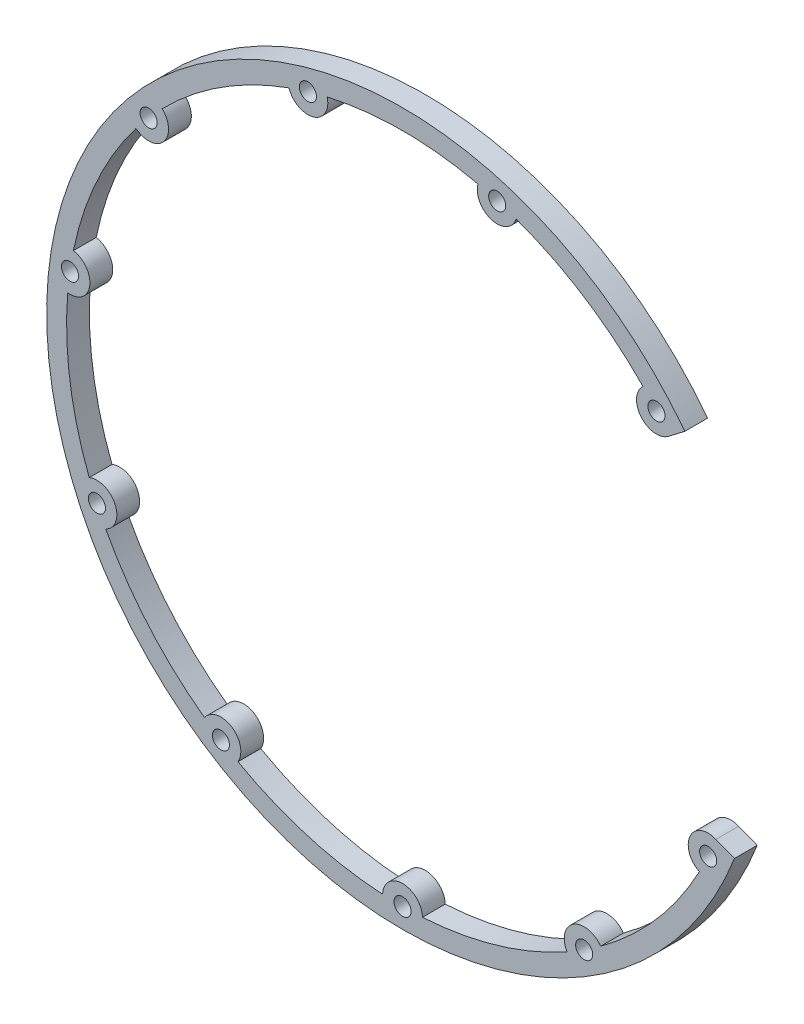
ISO-10303-21;
HEADER;
FILE_DESCRIPTION(('STEP AP214'),'2;1');
FILE_NAME('part.step','',(''),(''),'','','');
FILE_SCHEMA(('AUTOMOTIVE_DESIGN { 1 0 10303 214 1 1 1 1 }'));
ENDSEC;
DATA;
#1=APPLICATION_CONTEXT('core data for automotive mechanical design processes');
#2=APPLICATION_PROTOCOL_DEFINITION('international standard','automotive_design',2000,#1);
#3=PRODUCT_CONTEXT('',#1,'mechanical');
#4=PRODUCT('Part','Part','',(#3));
#5=PRODUCT_RELATED_PRODUCT_CATEGORY('part','',(#4));
#6=PRODUCT_DEFINITION_FORMATION('','',#4);
#7=PRODUCT_DEFINITION_CONTEXT('part definition',#1,'design');
#8=PRODUCT_DEFINITION('design','',#6,#7);
#9=PRODUCT_DEFINITION_SHAPE('','',#8);
#10=(LENGTH_UNIT() NAMED_UNIT(*) SI_UNIT(.MILLI.,.METRE.));
#11=(NAMED_UNIT(*) PLANE_ANGLE_UNIT() SI_UNIT($,.RADIAN.));
#12=(NAMED_UNIT(*) SI_UNIT($,.STERADIAN.) SOLID_ANGLE_UNIT());
#13=UNCERTAINTY_MEASURE_WITH_UNIT(LENGTH_MEASURE(1.E-05),#10,'distance_accuracy_value','');
#14=(GEOMETRIC_REPRESENTATION_CONTEXT(3) GLOBAL_UNCERTAINTY_ASSIGNED_CONTEXT((#13)) GLOBAL_UNIT_ASSIGNED_CONTEXT((#10,
#11,#12)) REPRESENTATION_CONTEXT('',''));
#15=CARTESIAN_POINT('',(0.,0.,0.));
#16=DIRECTION('',(0.,0.,1.));
#17=DIRECTION('',(1.,0.,0.));
#18=AXIS2_PLACEMENT_3D('',#15,#16,#17);
#19=CARTESIAN_POINT('',(0.,0.,4.));
#20=DIRECTION('',(0.,0.,-1.));
#21=DIRECTION('',(-1.,0.,0.));
#22=AXIS2_PLACEMENT_3D('',#19,#20,#21);
#23=PLANE('',#22);
#24=CARTESIAN_POINT('',(0.,0.,4.));
#25=DIRECTION('',(0.,0.,-1.));
#26=DIRECTION('',(-1.,0.,0.));
#27=AXIS2_PLACEMENT_3D('',#24,#25,#26);
#28=CIRCLE('',#27,59.);
#29=CARTESIAN_POINT('',(28.8985905029534,-51.4380352165847,4.));
#30=VERTEX_POINT('',#29);
#31=CARTESIAN_POINT('',(3.49846005335218,-58.896186440678,4.));
#32=VERTEX_POINT('',#31);
#33=EDGE_CURVE('E290',#30,#32,#28,.T.);
#34=ORIENTED_EDGE('',*,*,#33,.T.);
#35=CARTESIAN_POINT('',(0.,-59.,4.));
#36=DIRECTION('',(0.,0.,1.));
#37=DIRECTION('',(1.,0.,0.));
#38=AXIS2_PLACEMENT_3D('',#35,#36,#37);
#39=CIRCLE('',#38,3.5);
#40=CARTESIAN_POINT('',(-3.49846005335218,-58.896186440678,4.));
#41=VERTEX_POINT('',#40);
#42=EDGE_CURVE('E142',#32,#41,#39,.T.);
#43=ORIENTED_EDGE('',*,*,#42,.T.);
#44=CARTESIAN_POINT('',(0.,0.,4.));
#45=DIRECTION('',(0.,0.,-1.));
#46=DIRECTION('',(-1.,0.,0.));
#47=AXIS2_PLACEMENT_3D('',#44,#45,#46);
#48=CIRCLE('',#47,59.);
#49=CARTESIAN_POINT('',(-28.8985905029542,-51.4380352165843,4.));
#50=VERTEX_POINT('',#49);
#51=EDGE_CURVE('E367',#41,#50,#48,.T.);
#52=ORIENTED_EDGE('',*,*,#51,.T.);
#53=CARTESIAN_POINT('',(-31.8978082298803,-49.6339584370397,4.));
#54=DIRECTION('',(0.,0.,1.));
#55=DIRECTION('',(1.,0.,0.));
#56=AXIS2_PLACEMENT_3D('',#53,#54,#55);
#57=CIRCLE('',#56,3.5);
#58=CARTESIAN_POINT('',(-34.7847742616568,-47.6552146104242,4.));
#59=VERTEX_POINT('',#58);
#60=EDGE_CURVE('E387',#50,#59,#57,.T.);
#61=ORIENTED_EDGE('',*,*,#60,.T.);
#62=CARTESIAN_POINT('',(0.,0.,4.));
#63=DIRECTION('',(0.,0.,-1.));
#64=DIRECTION('',(-1.,0.,0.));
#65=AXIS2_PLACEMENT_3D('',#62,#63,#64);
#66=CIRCLE('',#65,59.);
#67=CARTESIAN_POINT('',(-52.1205427622558,-27.6486712550145,4.));
#68=VERTEX_POINT('',#67);
#69=EDGE_CURVE('E383',#59,#68,#66,.T.);
#70=ORIENTED_EDGE('',*,*,#69,.T.);
#71=CARTESIAN_POINT('',(-53.6682877259166,-24.5094857671112,4.));
#72=DIRECTION('',(0.,0.,1.));
#73=DIRECTION('',(1.,0.,0.));
#74=AXIS2_PLACEMENT_3D('',#71,#72,#73);
#75=CIRCLE('',#74,3.5);
#76=CARTESIAN_POINT('',(-55.0271684193556,-21.2840488570168,4.));
#77=VERTEX_POINT('',#76);
#78=EDGE_CURVE('E386',#68,#77,#75,.T.);
#79=ORIENTED_EDGE('',*,*,#78,.T.);
#80=CARTESIAN_POINT('',(0.,0.,4.));
#81=DIRECTION('',(0.,0.,-1.));
#82=DIRECTION('',(-1.,0.,0.));
#83=AXIS2_PLACEMENT_3D('',#80,#81,#82);
#84=CIRCLE('',#83,59.);
#85=CARTESIAN_POINT('',(-58.7945909606985,4.91895047384666,4.));
#86=VERTEX_POINT('',#85);
#87=EDGE_CURVE('E391',#77,#86,#84,.T.);
#88=ORIENTED_EDGE('',*,*,#87,.T.);
#89=CARTESIAN_POINT('',(-58.399465070975,8.39657545812405,4.));
#90=DIRECTION('',(0.,0.,1.));
#91=DIRECTION('',(1.,0.,0.));
#92=AXIS2_PLACEMENT_3D('',#89,#90,#91);
#93=CIRCLE('',#92,3.5);
#94=CARTESIAN_POINT('',(-57.7988254073017,11.8446520225905,4.));
#95=VERTEX_POINT('',#94);
#96=EDGE_CURVE('E398',#86,#95,#93,.T.);
#97=ORIENTED_EDGE('',*,*,#96,.T.);
#98=CARTESIAN_POINT('',(0.,0.,4.));
#99=DIRECTION('',(0.,0.,-1.));
#100=DIRECTION('',(-1.,0.,0.));
#101=AXIS2_PLACEMENT_3D('',#98,#99,#100);
#102=CIRCLE('',#101,59.);
#103=CARTESIAN_POINT('',(-46.8017719518477,35.9248401829047,4.));
#104=VERTEX_POINT('',#103);
#105=EDGE_CURVE('E401',#95,#104,#102,.T.);
#106=ORIENTED_EDGE('',*,*,#105,.T.);
#107=CARTESIAN_POINT('',(-44.589224886901,38.6367833027721,4.));
#108=DIRECTION('',(0.,0.,1.));
#109=DIRECTION('',(1.,0.,0.));
#110=AXIS2_PLACEMENT_3D('',#107,#108,#109);
#111=CIRCLE('',#110,3.50000000000001);
#112=CARTESIAN_POINT('',(-42.2197637154147,41.2127595753372,4.));
#113=VERTEX_POINT('',#112);
#114=EDGE_CURVE('E404',#104,#113,#111,.T.);
#115=ORIENTED_EDGE('',*,*,#114,.T.);
#116=CARTESIAN_POINT('',(0.,0.,4.));
#117=DIRECTION('',(0.,0.,-1.));
#118=DIRECTION('',(-1.,0.,0.));
#119=AXIS2_PLACEMENT_3D('',#116,#117,#118);
#120=CIRCLE('',#119,59.);
#121=CARTESIAN_POINT('',(-19.9497210338038,55.5248469666816,4.));
#122=VERTEX_POINT('',#121);
#123=EDGE_CURVE('E407',#113,#122,#120,.T.);
#124=ORIENTED_EDGE('',*,*,#123,.T.);
#125=CARTESIAN_POINT('',(-16.622220853644,56.6100854432555,4.));
#126=DIRECTION('',(0.,0.,1.));
#127=DIRECTION('',(1.,0.,0.));
#128=AXIS2_PLACEMENT_3D('',#125,#126,#127);
#129=CIRCLE('',#128,3.5);
#130=CARTESIAN_POINT('',(-13.236225354479,57.4961071583586,4.));
#131=VERTEX_POINT('',#130);
#132=EDGE_CURVE('E410',#122,#131,#129,.T.);
#133=ORIENTED_EDGE('',*,*,#132,.T.);
#134=CARTESIAN_POINT('',(0.,0.,4.));
#135=DIRECTION('',(0.,0.,-1.));
#136=DIRECTION('',(-1.,0.,0.));
#137=AXIS2_PLACEMENT_3D('',#134,#135,#136);
#138=CIRCLE('',#137,59.);
#139=CARTESIAN_POINT('',(13.2362253544798,57.4961071583584,4.));
#140=VERTEX_POINT('',#139);
#141=EDGE_CURVE('E413',#131,#140,#138,.T.);
#142=ORIENTED_EDGE('',*,*,#141,.T.);
#143=CARTESIAN_POINT('',(16.6222208536448,56.6100854432552,4.));
#144=DIRECTION('',(0.,0.,1.));
#145=DIRECTION('',(1.,0.,0.));
#146=AXIS2_PLACEMENT_3D('',#143,#144,#145);
#147=CIRCLE('',#146,3.5);
#148=CARTESIAN_POINT('',(19.9497210338046,55.5248469666813,4.));
#149=VERTEX_POINT('',#148);
#150=EDGE_CURVE('E416',#140,#149,#147,.T.);
#151=ORIENTED_EDGE('',*,*,#150,.T.);
#152=CARTESIAN_POINT('',(0.,0.,4.));
#153=DIRECTION('',(0.,0.,-1.));
#154=DIRECTION('',(-1.,0.,0.));
#155=AXIS2_PLACEMENT_3D('',#152,#153,#154);
#156=CIRCLE('',#155,59.);
#157=CARTESIAN_POINT('',(42.2197637154153,41.2127595753366,4.));
#158=VERTEX_POINT('',#157);
#159=EDGE_CURVE('E419',#149,#158,#156,.T.);
#160=ORIENTED_EDGE('',*,*,#159,.T.);
#161=CARTESIAN_POINT('',(44.5892248869016,38.6367833027714,4.));
#162=DIRECTION('',(0.,0.,1.));
#163=DIRECTION('',(1.,0.,0.));
#164=AXIS2_PLACEMENT_3D('',#161,#162,#163);
#165=CIRCLE('',#164,3.5);
#166=CARTESIAN_POINT('',(46.8017719518482,35.924840182904,4.));
#167=VERTEX_POINT('',#166);
#168=EDGE_CURVE('E422',#158,#167,#165,.T.);
#169=ORIENTED_EDGE('',*,*,#168,.T.);
#170=DIRECTION('',(0.793250372065128,0.608895596320532,0.));
#171=VECTOR('',#170,1.);
#172=CARTESIAN_POINT('',(46.8017719518482,35.924840182904,4.));
#173=LINE('',#172,#171);
#174=CARTESIAN_POINT('',(49.5781482540761,38.0559747700259,4.));
#175=VERTEX_POINT('',#174);
#176=EDGE_CURVE('E425',#167,#175,#173,.T.);
#177=ORIENTED_EDGE('',*,*,#176,.T.);
#178=CARTESIAN_POINT('',(0.,0.,4.));
#179=DIRECTION('',(0.,0.,1.));
#180=DIRECTION('',(1.,0.,0.));
#181=AXIS2_PLACEMENT_3D('',#178,#179,#180);
#182=CIRCLE('',#181,62.5);
#183=CARTESIAN_POINT('',(58.2914919696562,-22.5466619248061,4.));
#184=VERTEX_POINT('',#183);
#185=EDGE_CURVE('E428',#175,#184,#182,.T.);
#186=ORIENTED_EDGE('',*,*,#185,.T.);
#187=DIRECTION('',(-0.932663871514576,0.360746590796702,0.));
#188=VECTOR('',#187,1.);
#189=CARTESIAN_POINT('',(55.0271684193553,-21.2840488570176,4.));
#190=LINE('',#189,#188);
#191=CARTESIAN_POINT('',(55.0271684193553,-21.2840488570176,4.));
#192=VERTEX_POINT('',#191);
#193=EDGE_CURVE('E203',#184,#192,#190,.T.);
#194=ORIENTED_EDGE('',*,*,#193,.T.);
#195=CARTESIAN_POINT('',(53.6682877259163,-24.5094857671119,4.));
#196=DIRECTION('',(0.,0.,1.));
#197=DIRECTION('',(1.,0.,0.));
#198=AXIS2_PLACEMENT_3D('',#195,#196,#197);
#199=CIRCLE('',#198,3.5);
#200=CARTESIAN_POINT('',(52.1205427622554,-27.6486712550152,4.));
#201=VERTEX_POINT('',#200);
#202=EDGE_CURVE('E197',#192,#201,#199,.T.);
#203=ORIENTED_EDGE('',*,*,#202,.T.);
#204=CARTESIAN_POINT('',(0.,0.,4.));
#205=DIRECTION('',(0.,0.,-1.));
#206=DIRECTION('',(-1.,0.,0.));
#207=AXIS2_PLACEMENT_3D('',#204,#205,#206);
#208=CIRCLE('',#207,59.);
#209=CARTESIAN_POINT('',(34.784774261656,-47.6552146104247,4.));
#210=VERTEX_POINT('',#209);
#211=EDGE_CURVE('E201',#201,#210,#208,.T.);
#212=ORIENTED_EDGE('',*,*,#211,.T.);
#213=CARTESIAN_POINT('',(31.8978082298796,-49.6339584370401,4.));
#214=DIRECTION('',(0.,0.,1.));
#215=DIRECTION('',(1.,0.,0.));
#216=AXIS2_PLACEMENT_3D('',#213,#214,#215);
#217=CIRCLE('',#216,3.50000000000003);
#218=EDGE_CURVE('E57',#210,#30,#217,.T.);
#219=ORIENTED_EDGE('',*,*,#218,.T.);
#220=EDGE_LOOP('',(#34,#43,#52,#61,#70,#79,#88,#97,#106,#115,#124,#133,#142,#151,#160,#169,#177,
#186,#194,#203,#212,#219));
#221=FACE_BOUND('',#220,.T.);
#222=CARTESIAN_POINT('',(0.,-59.,4.));
#223=DIRECTION('',(0.,0.,1.));
#224=DIRECTION('',(1.,0.,0.));
#225=AXIS2_PLACEMENT_3D('',#222,#223,#224);
#226=CIRCLE('',#225,1.5);
#227=CARTESIAN_POINT('',(1.5,-59.,4.));
#228=VERTEX_POINT('',#227);
#229=EDGE_CURVE('E230',#228,#228,#226,.T.);
#230=ORIENTED_EDGE('',*,*,#229,.F.);
#231=EDGE_LOOP('',(#230));
#232=FACE_BOUND('',#231,.T.);
#233=CARTESIAN_POINT('',(-31.8978082298803,-49.6339584370396,4.));
#234=DIRECTION('',(0.,0.,1.));
#235=DIRECTION('',(1.,0.,0.));
#236=AXIS2_PLACEMENT_3D('',#233,#234,#235);
#237=CIRCLE('',#236,1.5);
#238=CARTESIAN_POINT('',(-30.3978082298803,-49.6339584370396,4.));
#239=VERTEX_POINT('',#238);
#240=EDGE_CURVE('E570',#239,#239,#237,.T.);
#241=ORIENTED_EDGE('',*,*,#240,.F.);
#242=EDGE_LOOP('',(#241));
#243=FACE_BOUND('',#242,.T.);
#244=CARTESIAN_POINT('',(-53.6682877259166,-24.5094857671112,4.));
#245=DIRECTION('',(0.,0.,1.));
#246=DIRECTION('',(1.,0.,0.));
#247=AXIS2_PLACEMENT_3D('',#244,#245,#246);
#248=CIRCLE('',#247,1.49999999999999);
#249=CARTESIAN_POINT('',(-52.1682877259166,-24.5094857671112,4.));
#250=VERTEX_POINT('',#249);
#251=EDGE_CURVE('E562',#250,#250,#248,.T.);
#252=ORIENTED_EDGE('',*,*,#251,.F.);
#253=EDGE_LOOP('',(#252));
#254=FACE_BOUND('',#253,.T.);
#255=CARTESIAN_POINT('',(-58.399465070975,8.39657545812405,4.));
#256=DIRECTION('',(0.,0.,1.));
#257=DIRECTION('',(1.,0.,0.));
#258=AXIS2_PLACEMENT_3D('',#255,#256,#257);
#259=CIRCLE('',#258,1.5);
#260=CARTESIAN_POINT('',(-56.899465070975,8.39657545812405,4.));
#261=VERTEX_POINT('',#260);
#262=EDGE_CURVE('E554',#261,#261,#259,.T.);
#263=ORIENTED_EDGE('',*,*,#262,.F.);
#264=EDGE_LOOP('',(#263));
#265=FACE_BOUND('',#264,.T.);
#266=CARTESIAN_POINT('',(-44.5892248869011,38.6367833027721,4.));
#267=DIRECTION('',(0.,0.,1.));
#268=DIRECTION('',(1.,0.,0.));
#269=AXIS2_PLACEMENT_3D('',#266,#267,#268);
#270=CIRCLE('',#269,1.5);
#271=CARTESIAN_POINT('',(-43.0892248869011,38.6367833027721,4.));
#272=VERTEX_POINT('',#271);
#273=EDGE_CURVE('E546',#272,#272,#270,.T.);
#274=ORIENTED_EDGE('',*,*,#273,.F.);
#275=EDGE_LOOP('',(#274));
#276=FACE_BOUND('',#275,.T.);
#277=CARTESIAN_POINT('',(-16.622220853644,56.6100854432555,4.));
#278=DIRECTION('',(0.,0.,1.));
#279=DIRECTION('',(1.,0.,0.));
#280=AXIS2_PLACEMENT_3D('',#277,#278,#279);
#281=CIRCLE('',#280,1.5);
#282=CARTESIAN_POINT('',(-15.122220853644,56.6100854432555,4.));
#283=VERTEX_POINT('',#282);
#284=EDGE_CURVE('E538',#283,#283,#281,.T.);
#285=ORIENTED_EDGE('',*,*,#284,.F.);
#286=EDGE_LOOP('',(#285));
#287=FACE_BOUND('',#286,.T.);
#288=CARTESIAN_POINT('',(16.6222208536448,56.6100854432552,4.));
#289=DIRECTION('',(0.,0.,1.));
#290=DIRECTION('',(1.,0.,0.));
#291=AXIS2_PLACEMENT_3D('',#288,#289,#290);
#292=CIRCLE('',#291,1.5);
#293=CARTESIAN_POINT('',(18.1222208536448,56.6100854432552,4.));
#294=VERTEX_POINT('',#293);
#295=EDGE_CURVE('E530',#294,#294,#292,.T.);
#296=ORIENTED_EDGE('',*,*,#295,.F.);
#297=EDGE_LOOP('',(#296));
#298=FACE_BOUND('',#297,.T.);
#299=CARTESIAN_POINT('',(44.5892248869016,38.6367833027714,4.));
#300=DIRECTION('',(0.,0.,1.));
#301=DIRECTION('',(1.,0.,0.));
#302=AXIS2_PLACEMENT_3D('',#299,#300,#301);
#303=CIRCLE('',#302,1.50000000000001);
#304=CARTESIAN_POINT('',(46.0892248869016,38.6367833027714,4.));
#305=VERTEX_POINT('',#304);
#306=EDGE_CURVE('E522',#305,#305,#303,.T.);
#307=ORIENTED_EDGE('',*,*,#306,.F.);
#308=EDGE_LOOP('',(#307));
#309=FACE_BOUND('',#308,.T.);
#310=CARTESIAN_POINT('',(53.6682877259163,-24.5094857671119,4.));
#311=DIRECTION('',(0.,0.,1.));
#312=DIRECTION('',(1.,0.,0.));
#313=AXIS2_PLACEMENT_3D('',#310,#311,#312);
#314=CIRCLE('',#313,1.5);
#315=CARTESIAN_POINT('',(55.1682877259163,-24.5094857671119,4.));
#316=VERTEX_POINT('',#315);
#317=EDGE_CURVE('E514',#316,#316,#314,.T.);
#318=ORIENTED_EDGE('',*,*,#317,.F.);
#319=EDGE_LOOP('',(#318));
#320=FACE_BOUND('',#319,.T.);
#321=CARTESIAN_POINT('',(31.8978082298796,-49.6339584370401,4.));
#322=DIRECTION('',(0.,0.,1.));
#323=DIRECTION('',(1.,0.,0.));
#324=AXIS2_PLACEMENT_3D('',#321,#322,#323);
#325=CIRCLE('',#324,1.5);
#326=CARTESIAN_POINT('',(33.3978082298796,-49.6339584370401,4.));
#327=VERTEX_POINT('',#326);
#328=EDGE_CURVE('E503',#327,#327,#325,.T.);
#329=ORIENTED_EDGE('',*,*,#328,.F.);
#330=EDGE_LOOP('',(#329));
#331=FACE_BOUND('',#330,.T.);
#332=ADVANCED_FACE('F39',(#221,#232,#243,#254,#265,#276,#287,#298,#309,#320,#331),#23,.F.);
#333=CARTESIAN_POINT('',(0.,0.,0.));
#334=DIRECTION('',(0.,0.,-1.));
#335=DIRECTION('',(-1.,0.,0.));
#336=AXIS2_PLACEMENT_3D('',#333,#334,#335);
#337=PLANE('',#336);
#338=CARTESIAN_POINT('',(53.6682877259163,-24.5094857671119,0.));
#339=DIRECTION('',(0.,0.,1.));
#340=DIRECTION('',(1.,0.,0.));
#341=AXIS2_PLACEMENT_3D('',#338,#339,#340);
#342=CIRCLE('',#341,1.5);
#343=CARTESIAN_POINT('',(55.1682877259163,-24.5094857671119,0.));
#344=VERTEX_POINT('',#343);
#345=EDGE_CURVE('E511',#344,#344,#342,.T.);
#346=ORIENTED_EDGE('',*,*,#345,.T.);
#347=EDGE_LOOP('',(#346));
#348=FACE_BOUND('',#347,.T.);
#349=CARTESIAN_POINT('',(16.6222208536448,56.6100854432552,0.));
#350=DIRECTION('',(0.,0.,1.));
#351=DIRECTION('',(1.,0.,0.));
#352=AXIS2_PLACEMENT_3D('',#349,#350,#351);
#353=CIRCLE('',#352,1.5);
#354=CARTESIAN_POINT('',(18.1222208536448,56.6100854432552,0.));
#355=VERTEX_POINT('',#354);
#356=EDGE_CURVE('E526',#355,#355,#353,.T.);
#357=ORIENTED_EDGE('',*,*,#356,.T.);
#358=EDGE_LOOP('',(#357));
#359=FACE_BOUND('',#358,.T.);
#360=CARTESIAN_POINT('',(-44.5892248869011,38.6367833027721,0.));
#361=DIRECTION('',(0.,0.,1.));
#362=DIRECTION('',(1.,0.,0.));
#363=AXIS2_PLACEMENT_3D('',#360,#361,#362);
#364=CIRCLE('',#363,1.5);
#365=CARTESIAN_POINT('',(-43.0892248869011,38.6367833027721,0.));
#366=VERTEX_POINT('',#365);
#367=EDGE_CURVE('E542',#366,#366,#364,.T.);
#368=ORIENTED_EDGE('',*,*,#367,.T.);
#369=EDGE_LOOP('',(#368));
#370=FACE_BOUND('',#369,.T.);
#371=CARTESIAN_POINT('',(-53.6682877259166,-24.5094857671112,0.));
#372=DIRECTION('',(0.,0.,1.));
#373=DIRECTION('',(1.,0.,0.));
#374=AXIS2_PLACEMENT_3D('',#371,#372,#373);
#375=CIRCLE('',#374,1.49999999999999);
#376=CARTESIAN_POINT('',(-52.1682877259166,-24.5094857671112,0.));
#377=VERTEX_POINT('',#376);
#378=EDGE_CURVE('E558',#377,#377,#375,.T.);
#379=ORIENTED_EDGE('',*,*,#378,.T.);
#380=EDGE_LOOP('',(#379));
#381=FACE_BOUND('',#380,.T.);
#382=CARTESIAN_POINT('',(0.,-59.,0.));
#383=DIRECTION('',(0.,0.,1.));
#384=DIRECTION('',(1.,0.,0.));
#385=AXIS2_PLACEMENT_3D('',#382,#383,#384);
#386=CIRCLE('',#385,1.5);
#387=CARTESIAN_POINT('',(1.5,-59.,0.));
#388=VERTEX_POINT('',#387);
#389=EDGE_CURVE('E574',#388,#388,#386,.T.);
#390=ORIENTED_EDGE('',*,*,#389,.T.);
#391=EDGE_LOOP('',(#390));
#392=FACE_BOUND('',#391,.T.);
#393=CARTESIAN_POINT('',(0.,0.,0.));
#394=DIRECTION('',(0.,0.,-1.));
#395=DIRECTION('',(-1.,0.,0.));
#396=AXIS2_PLACEMENT_3D('',#393,#394,#395);
#397=CIRCLE('',#396,59.);
#398=CARTESIAN_POINT('',(28.8985905029534,-51.4380352165847,0.));
#399=VERTEX_POINT('',#398);
#400=CARTESIAN_POINT('',(3.49846005335218,-58.896186440678,0.));
#401=VERTEX_POINT('',#400);
#402=EDGE_CURVE('E225',#399,#401,#397,.T.);
#403=ORIENTED_EDGE('',*,*,#402,.F.);
#404=CARTESIAN_POINT('',(31.8978082298796,-49.6339584370401,0.));
#405=DIRECTION('',(0.,0.,1.));
#406=DIRECTION('',(1.,0.,0.));
#407=AXIS2_PLACEMENT_3D('',#404,#405,#406);
#408=CIRCLE('',#407,3.50000000000003);
#409=CARTESIAN_POINT('',(34.784774261656,-47.6552146104247,0.));
#410=VERTEX_POINT('',#409);
#411=EDGE_CURVE('E134',#410,#399,#408,.T.);
#412=ORIENTED_EDGE('',*,*,#411,.F.);
#413=CARTESIAN_POINT('',(0.,0.,0.));
#414=DIRECTION('',(0.,0.,-1.));
#415=DIRECTION('',(-1.,0.,0.));
#416=AXIS2_PLACEMENT_3D('',#413,#414,#415);
#417=CIRCLE('',#416,59.);
#418=CARTESIAN_POINT('',(52.1205427622554,-27.6486712550152,0.));
#419=VERTEX_POINT('',#418);
#420=EDGE_CURVE('E128',#419,#410,#417,.T.);
#421=ORIENTED_EDGE('',*,*,#420,.F.);
#422=CARTESIAN_POINT('',(53.6682877259163,-24.5094857671119,0.));
#423=DIRECTION('',(0.,0.,1.));
#424=DIRECTION('',(1.,0.,0.));
#425=AXIS2_PLACEMENT_3D('',#422,#423,#424);
#426=CIRCLE('',#425,3.5);
#427=CARTESIAN_POINT('',(55.0271684193553,-21.2840488570176,0.));
#428=VERTEX_POINT('',#427);
#429=EDGE_CURVE('E212',#428,#419,#426,.T.);
#430=ORIENTED_EDGE('',*,*,#429,.F.);
#431=DIRECTION('',(-0.932663871514576,0.360746590796702,0.));
#432=VECTOR('',#431,1.);
#433=CARTESIAN_POINT('',(55.0271684193553,-21.2840488570176,0.));
#434=LINE('',#433,#432);
#435=CARTESIAN_POINT('',(58.2914919696562,-22.5466619248061,0.));
#436=VERTEX_POINT('',#435);
#437=EDGE_CURVE('E281',#436,#428,#434,.T.);
#438=ORIENTED_EDGE('',*,*,#437,.F.);
#439=CARTESIAN_POINT('',(0.,0.,0.));
#440=DIRECTION('',(0.,0.,1.));
#441=DIRECTION('',(1.,0.,0.));
#442=AXIS2_PLACEMENT_3D('',#439,#440,#441);
#443=CIRCLE('',#442,62.5);
#444=CARTESIAN_POINT('',(49.5781482540761,38.0559747700259,0.));
#445=VERTEX_POINT('',#444);
#446=EDGE_CURVE('E278',#445,#436,#443,.T.);
#447=ORIENTED_EDGE('',*,*,#446,.F.);
#448=DIRECTION('',(0.793250372065128,0.608895596320532,0.));
#449=VECTOR('',#448,1.);
#450=CARTESIAN_POINT('',(46.8017719518482,35.924840182904,0.));
#451=LINE('',#450,#449);
#452=CARTESIAN_POINT('',(46.8017719518482,35.924840182904,0.));
#453=VERTEX_POINT('',#452);
#454=EDGE_CURVE('E275',#453,#445,#451,.T.);
#455=ORIENTED_EDGE('',*,*,#454,.F.);
#456=CARTESIAN_POINT('',(44.5892248869016,38.6367833027714,0.));
#457=DIRECTION('',(0.,0.,1.));
#458=DIRECTION('',(1.,0.,0.));
#459=AXIS2_PLACEMENT_3D('',#456,#457,#458);
#460=CIRCLE('',#459,3.5);
#461=CARTESIAN_POINT('',(42.2197637154153,41.2127595753366,0.));
#462=VERTEX_POINT('',#461);
#463=EDGE_CURVE('E272',#462,#453,#460,.T.);
#464=ORIENTED_EDGE('',*,*,#463,.F.);
#465=CARTESIAN_POINT('',(0.,0.,0.));
#466=DIRECTION('',(0.,0.,-1.));
#467=DIRECTION('',(-1.,0.,0.));
#468=AXIS2_PLACEMENT_3D('',#465,#466,#467);
#469=CIRCLE('',#468,59.);
#470=CARTESIAN_POINT('',(19.9497210338046,55.5248469666813,0.));
#471=VERTEX_POINT('',#470);
#472=EDGE_CURVE('E269',#471,#462,#469,.T.);
#473=ORIENTED_EDGE('',*,*,#472,.F.);
#474=CARTESIAN_POINT('',(16.6222208536448,56.6100854432552,0.));
#475=DIRECTION('',(0.,0.,1.));
#476=DIRECTION('',(1.,0.,0.));
#477=AXIS2_PLACEMENT_3D('',#474,#475,#476);
#478=CIRCLE('',#477,3.5);
#479=CARTESIAN_POINT('',(13.2362253544798,57.4961071583584,0.));
#480=VERTEX_POINT('',#479);
#481=EDGE_CURVE('E266',#480,#471,#478,.T.);
#482=ORIENTED_EDGE('',*,*,#481,.F.);
#483=CARTESIAN_POINT('',(0.,0.,0.));
#484=DIRECTION('',(0.,0.,-1.));
#485=DIRECTION('',(-1.,0.,0.));
#486=AXIS2_PLACEMENT_3D('',#483,#484,#485);
#487=CIRCLE('',#486,59.);
#488=CARTESIAN_POINT('',(-13.236225354479,57.4961071583586,0.));
#489=VERTEX_POINT('',#488);
#490=EDGE_CURVE('E263',#489,#480,#487,.T.);
#491=ORIENTED_EDGE('',*,*,#490,.F.);
#492=CARTESIAN_POINT('',(-16.622220853644,56.6100854432555,0.));
#493=DIRECTION('',(0.,0.,1.));
#494=DIRECTION('',(1.,0.,0.));
#495=AXIS2_PLACEMENT_3D('',#492,#493,#494);
#496=CIRCLE('',#495,3.5);
#497=CARTESIAN_POINT('',(-19.9497210338038,55.5248469666816,0.));
#498=VERTEX_POINT('',#497);
#499=EDGE_CURVE('E260',#498,#489,#496,.T.);
#500=ORIENTED_EDGE('',*,*,#499,.F.);
#501=CARTESIAN_POINT('',(0.,0.,0.));
#502=DIRECTION('',(0.,0.,-1.));
#503=DIRECTION('',(-1.,0.,0.));
#504=AXIS2_PLACEMENT_3D('',#501,#502,#503);
#505=CIRCLE('',#504,59.);
#506=CARTESIAN_POINT('',(-42.2197637154147,41.2127595753372,0.));
#507=VERTEX_POINT('',#506);
#508=EDGE_CURVE('E257',#507,#498,#505,.T.);
#509=ORIENTED_EDGE('',*,*,#508,.F.);
#510=CARTESIAN_POINT('',(-44.589224886901,38.6367833027721,0.));
#511=DIRECTION('',(0.,0.,1.));
#512=DIRECTION('',(1.,0.,0.));
#513=AXIS2_PLACEMENT_3D('',#510,#511,#512);
#514=CIRCLE('',#513,3.50000000000001);
#515=CARTESIAN_POINT('',(-46.8017719518477,35.9248401829047,0.));
#516=VERTEX_POINT('',#515);
#517=EDGE_CURVE('E254',#516,#507,#514,.T.);
#518=ORIENTED_EDGE('',*,*,#517,.F.);
#519=CARTESIAN_POINT('',(0.,0.,0.));
#520=DIRECTION('',(0.,0.,-1.));
#521=DIRECTION('',(-1.,0.,0.));
#522=AXIS2_PLACEMENT_3D('',#519,#520,#521);
#523=CIRCLE('',#522,59.);
#524=CARTESIAN_POINT('',(-57.7988254073017,11.8446520225905,0.));
#525=VERTEX_POINT('',#524);
#526=EDGE_CURVE('E251',#525,#516,#523,.T.);
#527=ORIENTED_EDGE('',*,*,#526,.F.);
#528=CARTESIAN_POINT('',(-58.399465070975,8.39657545812405,0.));
#529=DIRECTION('',(0.,0.,1.));
#530=DIRECTION('',(1.,0.,0.));
#531=AXIS2_PLACEMENT_3D('',#528,#529,#530);
#532=CIRCLE('',#531,3.5);
#533=CARTESIAN_POINT('',(-58.7945909606985,4.91895047384666,0.));
#534=VERTEX_POINT('',#533);
#535=EDGE_CURVE('E248',#534,#525,#532,.T.);
#536=ORIENTED_EDGE('',*,*,#535,.F.);
#537=CARTESIAN_POINT('',(0.,0.,0.));
#538=DIRECTION('',(0.,0.,-1.));
#539=DIRECTION('',(-1.,0.,0.));
#540=AXIS2_PLACEMENT_3D('',#537,#538,#539);
#541=CIRCLE('',#540,59.);
#542=CARTESIAN_POINT('',(-55.0271684193556,-21.2840488570168,0.));
#543=VERTEX_POINT('',#542);
#544=EDGE_CURVE('E245',#543,#534,#541,.T.);
#545=ORIENTED_EDGE('',*,*,#544,.F.);
#546=CARTESIAN_POINT('',(-53.6682877259166,-24.5094857671112,0.));
#547=DIRECTION('',(0.,0.,1.));
#548=DIRECTION('',(1.,0.,0.));
#549=AXIS2_PLACEMENT_3D('',#546,#547,#548);
#550=CIRCLE('',#549,3.5);
#551=CARTESIAN_POINT('',(-52.1205427622558,-27.6486712550145,0.));
#552=VERTEX_POINT('',#551);
#553=EDGE_CURVE('E242',#552,#543,#550,.T.);
#554=ORIENTED_EDGE('',*,*,#553,.F.);
#555=CARTESIAN_POINT('',(0.,0.,0.));
#556=DIRECTION('',(0.,0.,-1.));
#557=DIRECTION('',(-1.,0.,0.));
#558=AXIS2_PLACEMENT_3D('',#555,#556,#557);
#559=CIRCLE('',#558,59.);
#560=CARTESIAN_POINT('',(-34.7847742616568,-47.6552146104242,0.));
#561=VERTEX_POINT('',#560);
#562=EDGE_CURVE('E239',#561,#552,#559,.T.);
#563=ORIENTED_EDGE('',*,*,#562,.F.);
#564=CARTESIAN_POINT('',(-31.8978082298803,-49.6339584370397,0.));
#565=DIRECTION('',(0.,0.,1.));
#566=DIRECTION('',(1.,0.,0.));
#567=AXIS2_PLACEMENT_3D('',#564,#565,#566);
#568=CIRCLE('',#567,3.5);
#569=CARTESIAN_POINT('',(-28.8985905029542,-51.4380352165843,0.));
#570=VERTEX_POINT('',#569);
#571=EDGE_CURVE('E236',#570,#561,#568,.T.);
#572=ORIENTED_EDGE('',*,*,#571,.F.);
#573=CARTESIAN_POINT('',(0.,0.,0.));
#574=DIRECTION('',(0.,0.,-1.));
#575=DIRECTION('',(-1.,0.,0.));
#576=AXIS2_PLACEMENT_3D('',#573,#574,#575);
#577=CIRCLE('',#576,59.);
#578=CARTESIAN_POINT('',(-3.49846005335218,-58.896186440678,0.));
#579=VERTEX_POINT('',#578);
#580=EDGE_CURVE('E233',#579,#570,#577,.T.);
#581=ORIENTED_EDGE('',*,*,#580,.F.);
#582=CARTESIAN_POINT('',(0.,-59.,0.));
#583=DIRECTION('',(0.,0.,1.));
#584=DIRECTION('',(1.,0.,0.));
#585=AXIS2_PLACEMENT_3D('',#582,#583,#584);
#586=CIRCLE('',#585,3.5);
#587=EDGE_CURVE('E229',#401,#579,#586,.T.);
#588=ORIENTED_EDGE('',*,*,#587,.F.);
#589=EDGE_LOOP('',(#403,#412,#421,#430,#438,#447,#455,#464,#473,#482,#491,#500,#509,#518,#527,
#536,#545,#554,#563,#572,#581,#588));
#590=FACE_BOUND('',#589,.T.);
#591=CARTESIAN_POINT('',(-31.8978082298803,-49.6339584370396,0.));
#592=DIRECTION('',(0.,0.,1.));
#593=DIRECTION('',(1.,0.,0.));
#594=AXIS2_PLACEMENT_3D('',#591,#592,#593);
#595=CIRCLE('',#594,1.5);
#596=CARTESIAN_POINT('',(-30.3978082298803,-49.6339584370396,0.));
#597=VERTEX_POINT('',#596);
#598=EDGE_CURVE('E566',#597,#597,#595,.T.);
#599=ORIENTED_EDGE('',*,*,#598,.T.);
#600=EDGE_LOOP('',(#599));
#601=FACE_BOUND('',#600,.T.);
#602=CARTESIAN_POINT('',(-58.399465070975,8.39657545812405,0.));
#603=DIRECTION('',(0.,0.,1.));
#604=DIRECTION('',(1.,0.,0.));
#605=AXIS2_PLACEMENT_3D('',#602,#603,#604);
#606=CIRCLE('',#605,1.5);
#607=CARTESIAN_POINT('',(-56.899465070975,8.39657545812405,0.));
#608=VERTEX_POINT('',#607);
#609=EDGE_CURVE('E550',#608,#608,#606,.T.);
#610=ORIENTED_EDGE('',*,*,#609,.T.);
#611=EDGE_LOOP('',(#610));
#612=FACE_BOUND('',#611,.T.);
#613=CARTESIAN_POINT('',(-16.622220853644,56.6100854432555,0.));
#614=DIRECTION('',(0.,0.,1.));
#615=DIRECTION('',(1.,0.,0.));
#616=AXIS2_PLACEMENT_3D('',#613,#614,#615);
#617=CIRCLE('',#616,1.5);
#618=CARTESIAN_POINT('',(-15.122220853644,56.6100854432555,0.));
#619=VERTEX_POINT('',#618);
#620=EDGE_CURVE('E534',#619,#619,#617,.T.);
#621=ORIENTED_EDGE('',*,*,#620,.T.);
#622=EDGE_LOOP('',(#621));
#623=FACE_BOUND('',#622,.T.);
#624=CARTESIAN_POINT('',(44.5892248869016,38.6367833027714,0.));
#625=DIRECTION('',(0.,0.,1.));
#626=DIRECTION('',(1.,0.,0.));
#627=AXIS2_PLACEMENT_3D('',#624,#625,#626);
#628=CIRCLE('',#627,1.50000000000001);
#629=CARTESIAN_POINT('',(46.0892248869016,38.6367833027714,0.));
#630=VERTEX_POINT('',#629);
#631=EDGE_CURVE('E518',#630,#630,#628,.T.);
#632=ORIENTED_EDGE('',*,*,#631,.T.);
#633=EDGE_LOOP('',(#632));
#634=FACE_BOUND('',#633,.T.);
#635=CARTESIAN_POINT('',(31.8978082298796,-49.6339584370401,0.));
#636=DIRECTION('',(0.,0.,1.));
#637=DIRECTION('',(1.,0.,0.));
#638=AXIS2_PLACEMENT_3D('',#635,#636,#637);
#639=CIRCLE('',#638,1.5);
#640=CARTESIAN_POINT('',(33.3978082298796,-49.6339584370401,0.));
#641=VERTEX_POINT('',#640);
#642=EDGE_CURVE('E506',#641,#641,#639,.T.);
#643=ORIENTED_EDGE('',*,*,#642,.T.);
#644=EDGE_LOOP('',(#643));
#645=FACE_BOUND('',#644,.T.);
#646=ADVANCED_FACE('F371',(#348,#359,#370,#381,#392,#590,#601,#612,#623,#634,#645),#337,.T.);
#647=CARTESIAN_POINT('',(0.,0.,4.));
#648=DIRECTION('',(0.,0.,-1.));
#649=DIRECTION('',(-1.,0.,0.));
#650=AXIS2_PLACEMENT_3D('',#647,#648,#649);
#651=CYLINDRICAL_SURFACE('',#650,59.);
#652=ORIENTED_EDGE('',*,*,#402,.T.);
#653=DIRECTION('',(0.,0.,-1.));
#654=VECTOR('',#653,1.);
#655=CARTESIAN_POINT('',(3.49846005335218,-58.896186440678,4.));
#656=LINE('',#655,#654);
#657=EDGE_CURVE('E11',#32,#401,#656,.T.);
#658=ORIENTED_EDGE('',*,*,#657,.F.);
#659=ORIENTED_EDGE('',*,*,#33,.F.);
#660=DIRECTION('',(0.,0.,-1.));
#661=VECTOR('',#660,1.);
#662=CARTESIAN_POINT('',(28.8985905029534,-51.4380352165847,4.));
#663=LINE('',#662,#661);
#664=EDGE_CURVE('E221',#30,#399,#663,.T.);
#665=ORIENTED_EDGE('',*,*,#664,.T.);
#666=EDGE_LOOP('',(#652,#658,#659,#665));
#667=FACE_BOUND('',#666,.T.);
#668=ADVANCED_FACE('F41',(#667),#651,.F.);
#669=CARTESIAN_POINT('',(0.,-59.,4.));
#670=DIRECTION('',(0.,0.,-1.));
#671=DIRECTION('',(-1.,0.,0.));
#672=AXIS2_PLACEMENT_3D('',#669,#670,#671);
#673=CYLINDRICAL_SURFACE('',#672,3.5);
#674=ORIENTED_EDGE('',*,*,#587,.T.);
#675=DIRECTION('',(0.,0.,-1.));
#676=VECTOR('',#675,1.);
#677=CARTESIAN_POINT('',(-3.49846005335218,-58.896186440678,4.));
#678=LINE('',#677,#676);
#679=EDGE_CURVE('E49',#41,#579,#678,.T.);
#680=ORIENTED_EDGE('',*,*,#679,.F.);
#681=ORIENTED_EDGE('',*,*,#42,.F.);
#682=ORIENTED_EDGE('',*,*,#657,.T.);
#683=EDGE_LOOP('',(#674,#680,#681,#682));
#684=FACE_BOUND('',#683,.T.);
#685=ADVANCED_FACE('F846',(#684),#673,.T.);
#686=CARTESIAN_POINT('',(0.,0.,4.));
#687=DIRECTION('',(0.,0.,-1.));
#688=DIRECTION('',(-1.,0.,0.));
#689=AXIS2_PLACEMENT_3D('',#686,#687,#688);
#690=CYLINDRICAL_SURFACE('',#689,59.);
#691=ORIENTED_EDGE('',*,*,#580,.T.);
#692=DIRECTION('',(0.,0.,-1.));
#693=VECTOR('',#692,1.);
#694=CARTESIAN_POINT('',(-28.8985905029542,-51.4380352165843,4.));
#695=LINE('',#694,#693);
#696=EDGE_CURVE('E357',#50,#570,#695,.T.);
#697=ORIENTED_EDGE('',*,*,#696,.F.);
#698=ORIENTED_EDGE('',*,*,#51,.F.);
#699=ORIENTED_EDGE('',*,*,#679,.T.);
#700=EDGE_LOOP('',(#691,#697,#698,#699));
#701=FACE_BOUND('',#700,.T.);
#702=ADVANCED_FACE('F365',(#701),#690,.F.);
#703=CARTESIAN_POINT('',(-31.8978082298803,-49.6339584370397,4.));
#704=DIRECTION('',(0.,0.,-1.));
#705=DIRECTION('',(-1.,0.,0.));
#706=AXIS2_PLACEMENT_3D('',#703,#704,#705);
#707=CYLINDRICAL_SURFACE('',#706,3.5);
#708=ORIENTED_EDGE('',*,*,#571,.T.);
#709=DIRECTION('',(0.,0.,-1.));
#710=VECTOR('',#709,1.);
#711=CARTESIAN_POINT('',(-34.7847742616568,-47.6552146104242,4.));
#712=LINE('',#711,#710);
#713=EDGE_CURVE('E353',#59,#561,#712,.T.);
#714=ORIENTED_EDGE('',*,*,#713,.F.);
#715=ORIENTED_EDGE('',*,*,#60,.F.);
#716=ORIENTED_EDGE('',*,*,#696,.T.);
#717=EDGE_LOOP('',(#708,#714,#715,#716));
#718=FACE_BOUND('',#717,.T.);
#719=ADVANCED_FACE('F377',(#718),#707,.T.);
#720=CARTESIAN_POINT('',(0.,0.,4.));
#721=DIRECTION('',(0.,0.,-1.));
#722=DIRECTION('',(-1.,0.,0.));
#723=AXIS2_PLACEMENT_3D('',#720,#721,#722);
#724=CYLINDRICAL_SURFACE('',#723,59.);
#725=ORIENTED_EDGE('',*,*,#562,.T.);
#726=DIRECTION('',(0.,0.,-1.));
#727=VECTOR('',#726,1.);
#728=CARTESIAN_POINT('',(-52.1205427622558,-27.6486712550145,4.));
#729=LINE('',#728,#727);
#730=EDGE_CURVE('E349',#68,#552,#729,.T.);
#731=ORIENTED_EDGE('',*,*,#730,.F.);
#732=ORIENTED_EDGE('',*,*,#69,.F.);
#733=ORIENTED_EDGE('',*,*,#713,.T.);
#734=EDGE_LOOP('',(#725,#731,#732,#733));
#735=FACE_BOUND('',#734,.T.);
#736=ADVANCED_FACE('F381',(#735),#724,.F.);
#737=CARTESIAN_POINT('',(-53.6682877259166,-24.5094857671112,4.));
#738=DIRECTION('',(0.,0.,-1.));
#739=DIRECTION('',(-1.,0.,0.));
#740=AXIS2_PLACEMENT_3D('',#737,#738,#739);
#741=CYLINDRICAL_SURFACE('',#740,3.5);
#742=ORIENTED_EDGE('',*,*,#553,.T.);
#743=DIRECTION('',(0.,0.,-1.));
#744=VECTOR('',#743,1.);
#745=CARTESIAN_POINT('',(-55.0271684193556,-21.2840488570168,4.));
#746=LINE('',#745,#744);
#747=EDGE_CURVE('E345',#77,#543,#746,.T.);
#748=ORIENTED_EDGE('',*,*,#747,.F.);
#749=ORIENTED_EDGE('',*,*,#78,.F.);
#750=ORIENTED_EDGE('',*,*,#730,.T.);
#751=EDGE_LOOP('',(#742,#748,#749,#750));
#752=FACE_BOUND('',#751,.T.);
#753=ADVANCED_FACE('F811',(#752),#741,.T.);
#754=CARTESIAN_POINT('',(0.,0.,4.));
#755=DIRECTION('',(0.,0.,-1.));
#756=DIRECTION('',(-1.,0.,0.));
#757=AXIS2_PLACEMENT_3D('',#754,#755,#756);
#758=CYLINDRICAL_SURFACE('',#757,59.);
#759=ORIENTED_EDGE('',*,*,#544,.T.);
#760=DIRECTION('',(0.,0.,-1.));
#761=VECTOR('',#760,1.);
#762=CARTESIAN_POINT('',(-58.7945909606985,4.91895047384666,4.));
#763=LINE('',#762,#761);
#764=EDGE_CURVE('E341',#86,#534,#763,.T.);
#765=ORIENTED_EDGE('',*,*,#764,.F.);
#766=ORIENTED_EDGE('',*,*,#87,.F.);
#767=ORIENTED_EDGE('',*,*,#747,.T.);
#768=EDGE_LOOP('',(#759,#765,#766,#767));
#769=FACE_BOUND('',#768,.T.);
#770=ADVANCED_FACE('F801',(#769),#758,.F.);
#771=CARTESIAN_POINT('',(-58.399465070975,8.39657545812405,4.));
#772=DIRECTION('',(0.,0.,-1.));
#773=DIRECTION('',(-1.,0.,0.));
#774=AXIS2_PLACEMENT_3D('',#771,#772,#773);
#775=CYLINDRICAL_SURFACE('',#774,3.5);
#776=ORIENTED_EDGE('',*,*,#535,.T.);
#777=DIRECTION('',(0.,0.,-1.));
#778=VECTOR('',#777,1.);
#779=CARTESIAN_POINT('',(-57.7988254073017,11.8446520225905,4.));
#780=LINE('',#779,#778);
#781=EDGE_CURVE('E337',#95,#525,#780,.T.);
#782=ORIENTED_EDGE('',*,*,#781,.F.);
#783=ORIENTED_EDGE('',*,*,#96,.F.);
#784=ORIENTED_EDGE('',*,*,#764,.T.);
#785=EDGE_LOOP('',(#776,#782,#783,#784));
#786=FACE_BOUND('',#785,.T.);
#787=ADVANCED_FACE('F791',(#786),#775,.T.);
#788=CARTESIAN_POINT('',(0.,0.,4.));
#789=DIRECTION('',(0.,0.,-1.));
#790=DIRECTION('',(-1.,0.,0.));
#791=AXIS2_PLACEMENT_3D('',#788,#789,#790);
#792=CYLINDRICAL_SURFACE('',#791,59.);
#793=ORIENTED_EDGE('',*,*,#526,.T.);
#794=DIRECTION('',(0.,0.,-1.));
#795=VECTOR('',#794,1.);
#796=CARTESIAN_POINT('',(-46.8017719518477,35.9248401829047,4.));
#797=LINE('',#796,#795);
#798=EDGE_CURVE('E333',#104,#516,#797,.T.);
#799=ORIENTED_EDGE('',*,*,#798,.F.);
#800=ORIENTED_EDGE('',*,*,#105,.F.);
#801=ORIENTED_EDGE('',*,*,#781,.T.);
#802=EDGE_LOOP('',(#793,#799,#800,#801));
#803=FACE_BOUND('',#802,.T.);
#804=ADVANCED_FACE('F781',(#803),#792,.F.);
#805=CARTESIAN_POINT('',(-44.589224886901,38.6367833027721,4.));
#806=DIRECTION('',(0.,0.,-1.));
#807=DIRECTION('',(-1.,0.,0.));
#808=AXIS2_PLACEMENT_3D('',#805,#806,#807);
#809=CYLINDRICAL_SURFACE('',#808,3.50000000000001);
#810=ORIENTED_EDGE('',*,*,#517,.T.);
#811=DIRECTION('',(0.,0.,-1.));
#812=VECTOR('',#811,1.);
#813=CARTESIAN_POINT('',(-42.2197637154147,41.2127595753372,4.));
#814=LINE('',#813,#812);
#815=EDGE_CURVE('E329',#113,#507,#814,.T.);
#816=ORIENTED_EDGE('',*,*,#815,.F.);
#817=ORIENTED_EDGE('',*,*,#114,.F.);
#818=ORIENTED_EDGE('',*,*,#798,.T.);
#819=EDGE_LOOP('',(#810,#816,#817,#818));
#820=FACE_BOUND('',#819,.T.);
#821=ADVANCED_FACE('F771',(#820),#809,.T.);
#822=CARTESIAN_POINT('',(0.,0.,4.));
#823=DIRECTION('',(0.,0.,-1.));
#824=DIRECTION('',(-1.,0.,0.));
#825=AXIS2_PLACEMENT_3D('',#822,#823,#824);
#826=CYLINDRICAL_SURFACE('',#825,59.);
#827=ORIENTED_EDGE('',*,*,#508,.T.);
#828=DIRECTION('',(0.,0.,-1.));
#829=VECTOR('',#828,1.);
#830=CARTESIAN_POINT('',(-19.9497210338038,55.5248469666816,4.));
#831=LINE('',#830,#829);
#832=EDGE_CURVE('E325',#122,#498,#831,.T.);
#833=ORIENTED_EDGE('',*,*,#832,.F.);
#834=ORIENTED_EDGE('',*,*,#123,.F.);
#835=ORIENTED_EDGE('',*,*,#815,.T.);
#836=EDGE_LOOP('',(#827,#833,#834,#835));
#837=FACE_BOUND('',#836,.T.);
#838=ADVANCED_FACE('F761',(#837),#826,.F.);
#839=CARTESIAN_POINT('',(-16.622220853644,56.6100854432555,4.));
#840=DIRECTION('',(0.,0.,-1.));
#841=DIRECTION('',(-1.,0.,0.));
#842=AXIS2_PLACEMENT_3D('',#839,#840,#841);
#843=CYLINDRICAL_SURFACE('',#842,3.5);
#844=ORIENTED_EDGE('',*,*,#499,.T.);
#845=DIRECTION('',(0.,0.,-1.));
#846=VECTOR('',#845,1.);
#847=CARTESIAN_POINT('',(-13.236225354479,57.4961071583586,4.));
#848=LINE('',#847,#846);
#849=EDGE_CURVE('E321',#131,#489,#848,.T.);
#850=ORIENTED_EDGE('',*,*,#849,.F.);
#851=ORIENTED_EDGE('',*,*,#132,.F.);
#852=ORIENTED_EDGE('',*,*,#832,.T.);
#853=EDGE_LOOP('',(#844,#850,#851,#852));
#854=FACE_BOUND('',#853,.T.);
#855=ADVANCED_FACE('F751',(#854),#843,.T.);
#856=CARTESIAN_POINT('',(0.,0.,4.));
#857=DIRECTION('',(0.,0.,-1.));
#858=DIRECTION('',(-1.,0.,0.));
#859=AXIS2_PLACEMENT_3D('',#856,#857,#858);
#860=CYLINDRICAL_SURFACE('',#859,59.);
#861=ORIENTED_EDGE('',*,*,#490,.T.);
#862=DIRECTION('',(0.,0.,-1.));
#863=VECTOR('',#862,1.);
#864=CARTESIAN_POINT('',(13.2362253544798,57.4961071583584,4.));
#865=LINE('',#864,#863);
#866=EDGE_CURVE('E317',#140,#480,#865,.T.);
#867=ORIENTED_EDGE('',*,*,#866,.F.);
#868=ORIENTED_EDGE('',*,*,#141,.F.);
#869=ORIENTED_EDGE('',*,*,#849,.T.);
#870=EDGE_LOOP('',(#861,#867,#868,#869));
#871=FACE_BOUND('',#870,.T.);
#872=ADVANCED_FACE('F741',(#871),#860,.F.);
#873=CARTESIAN_POINT('',(16.6222208536448,56.6100854432552,4.));
#874=DIRECTION('',(0.,0.,-1.));
#875=DIRECTION('',(-1.,0.,0.));
#876=AXIS2_PLACEMENT_3D('',#873,#874,#875);
#877=CYLINDRICAL_SURFACE('',#876,3.5);
#878=ORIENTED_EDGE('',*,*,#481,.T.);
#879=DIRECTION('',(0.,0.,-1.));
#880=VECTOR('',#879,1.);
#881=CARTESIAN_POINT('',(19.9497210338046,55.5248469666813,4.));
#882=LINE('',#881,#880);
#883=EDGE_CURVE('E313',#149,#471,#882,.T.);
#884=ORIENTED_EDGE('',*,*,#883,.F.);
#885=ORIENTED_EDGE('',*,*,#150,.F.);
#886=ORIENTED_EDGE('',*,*,#866,.T.);
#887=EDGE_LOOP('',(#878,#884,#885,#886));
#888=FACE_BOUND('',#887,.T.);
#889=ADVANCED_FACE('F731',(#888),#877,.T.);
#890=CARTESIAN_POINT('',(0.,0.,4.));
#891=DIRECTION('',(0.,0.,-1.));
#892=DIRECTION('',(-1.,0.,0.));
#893=AXIS2_PLACEMENT_3D('',#890,#891,#892);
#894=CYLINDRICAL_SURFACE('',#893,59.);
#895=ORIENTED_EDGE('',*,*,#472,.T.);
#896=DIRECTION('',(0.,0.,-1.));
#897=VECTOR('',#896,1.);
#898=CARTESIAN_POINT('',(42.2197637154153,41.2127595753366,4.));
#899=LINE('',#898,#897);
#900=EDGE_CURVE('E309',#158,#462,#899,.T.);
#901=ORIENTED_EDGE('',*,*,#900,.F.);
#902=ORIENTED_EDGE('',*,*,#159,.F.);
#903=ORIENTED_EDGE('',*,*,#883,.T.);
#904=EDGE_LOOP('',(#895,#901,#902,#903));
#905=FACE_BOUND('',#904,.T.);
#906=ADVANCED_FACE('F721',(#905),#894,.F.);
#907=CARTESIAN_POINT('',(44.5892248869016,38.6367833027714,4.));
#908=DIRECTION('',(0.,0.,-1.));
#909=DIRECTION('',(-1.,0.,0.));
#910=AXIS2_PLACEMENT_3D('',#907,#908,#909);
#911=CYLINDRICAL_SURFACE('',#910,3.5);
#912=ORIENTED_EDGE('',*,*,#463,.T.);
#913=DIRECTION('',(0.,0.,-1.));
#914=VECTOR('',#913,1.);
#915=CARTESIAN_POINT('',(46.8017719518482,35.924840182904,4.));
#916=LINE('',#915,#914);
#917=EDGE_CURVE('E305',#167,#453,#916,.T.);
#918=ORIENTED_EDGE('',*,*,#917,.F.);
#919=ORIENTED_EDGE('',*,*,#168,.F.);
#920=ORIENTED_EDGE('',*,*,#900,.T.);
#921=EDGE_LOOP('',(#912,#918,#919,#920));
#922=FACE_BOUND('',#921,.T.);
#923=ADVANCED_FACE('F711',(#922),#911,.T.);
#924=CARTESIAN_POINT('',(46.8017719518482,35.924840182904,4.));
#925=DIRECTION('',(-0.608895596320532,0.793250372065128,0.));
#926=DIRECTION('',(-0.793250372065128,-0.608895596320532,0.));
#927=AXIS2_PLACEMENT_3D('',#924,#925,#926);
#928=PLANE('',#927);
#929=ORIENTED_EDGE('',*,*,#454,.T.);
#930=DIRECTION('',(0.,0.,-1.));
#931=VECTOR('',#930,1.);
#932=CARTESIAN_POINT('',(49.5781482540761,38.0559747700259,4.));
#933=LINE('',#932,#931);
#934=EDGE_CURVE('E301',#175,#445,#933,.T.);
#935=ORIENTED_EDGE('',*,*,#934,.F.);
#936=ORIENTED_EDGE('',*,*,#176,.F.);
#937=ORIENTED_EDGE('',*,*,#917,.T.);
#938=EDGE_LOOP('',(#929,#935,#936,#937));
#939=FACE_BOUND('',#938,.T.);
#940=ADVANCED_FACE('F702',(#939),#928,.F.);
#941=CARTESIAN_POINT('',(0.,0.,4.));
#942=DIRECTION('',(0.,0.,-1.));
#943=DIRECTION('',(-1.,0.,0.));
#944=AXIS2_PLACEMENT_3D('',#941,#942,#943);
#945=CYLINDRICAL_SURFACE('',#944,62.5);
#946=ORIENTED_EDGE('',*,*,#446,.T.);
#947=DIRECTION('',(0.,0.,-1.));
#948=VECTOR('',#947,1.);
#949=CARTESIAN_POINT('',(58.2914919696562,-22.5466619248061,4.));
#950=LINE('',#949,#948);
#951=EDGE_CURVE('E297',#184,#436,#950,.T.);
#952=ORIENTED_EDGE('',*,*,#951,.F.);
#953=ORIENTED_EDGE('',*,*,#185,.F.);
#954=ORIENTED_EDGE('',*,*,#934,.T.);
#955=EDGE_LOOP('',(#946,#952,#953,#954));
#956=FACE_BOUND('',#955,.T.);
#957=ADVANCED_FACE('F436',(#956),#945,.T.);
#958=CARTESIAN_POINT('',(55.0271684193553,-21.2840488570176,4.));
#959=DIRECTION('',(-0.360746590796702,-0.932663871514576,0.));
#960=DIRECTION('',(0.932663871514576,-0.360746590796702,0.));
#961=AXIS2_PLACEMENT_3D('',#958,#959,#960);
#962=PLANE('',#961);
#963=ORIENTED_EDGE('',*,*,#437,.T.);
#964=DIRECTION('',(0.,0.,-1.));
#965=VECTOR('',#964,1.);
#966=CARTESIAN_POINT('',(55.0271684193553,-21.2840488570176,4.));
#967=LINE('',#966,#965);
#968=EDGE_CURVE('E214',#192,#428,#967,.T.);
#969=ORIENTED_EDGE('',*,*,#968,.F.);
#970=ORIENTED_EDGE('',*,*,#193,.F.);
#971=ORIENTED_EDGE('',*,*,#951,.T.);
#972=EDGE_LOOP('',(#963,#969,#970,#971));
#973=FACE_BOUND('',#972,.T.);
#974=ADVANCED_FACE('F440',(#973),#962,.F.);
#975=CARTESIAN_POINT('',(53.6682877259163,-24.5094857671119,4.));
#976=DIRECTION('',(0.,0.,-1.));
#977=DIRECTION('',(-1.,0.,0.));
#978=AXIS2_PLACEMENT_3D('',#975,#976,#977);
#979=CYLINDRICAL_SURFACE('',#978,3.5);
#980=ORIENTED_EDGE('',*,*,#429,.T.);
#981=DIRECTION('',(0.,0.,-1.));
#982=VECTOR('',#981,1.);
#983=CARTESIAN_POINT('',(52.1205427622554,-27.6486712550152,4.));
#984=LINE('',#983,#982);
#985=EDGE_CURVE('E209',#201,#419,#984,.T.);
#986=ORIENTED_EDGE('',*,*,#985,.F.);
#987=ORIENTED_EDGE('',*,*,#202,.F.);
#988=ORIENTED_EDGE('',*,*,#968,.T.);
#989=EDGE_LOOP('',(#980,#986,#987,#988));
#990=FACE_BOUND('',#989,.T.);
#991=ADVANCED_FACE('F210',(#990),#979,.T.);
#992=CARTESIAN_POINT('',(0.,0.,4.));
#993=DIRECTION('',(0.,0.,-1.));
#994=DIRECTION('',(-1.,0.,0.));
#995=AXIS2_PLACEMENT_3D('',#992,#993,#994);
#996=CYLINDRICAL_SURFACE('',#995,59.);
#997=ORIENTED_EDGE('',*,*,#420,.T.);
#998=DIRECTION('',(0.,0.,-1.));
#999=VECTOR('',#998,1.);
#1000=CARTESIAN_POINT('',(34.784774261656,-47.6552146104247,4.));
#1001=LINE('',#1000,#999);
#1002=EDGE_CURVE('E215',#210,#410,#1001,.T.);
#1003=ORIENTED_EDGE('',*,*,#1002,.F.);
#1004=ORIENTED_EDGE('',*,*,#211,.F.);
#1005=ORIENTED_EDGE('',*,*,#985,.T.);
#1006=EDGE_LOOP('',(#997,#1003,#1004,#1005));
#1007=FACE_BOUND('',#1006,.T.);
#1008=ADVANCED_FACE('F217',(#1007),#996,.F.);
#1009=CARTESIAN_POINT('',(31.8978082298796,-49.6339584370401,4.));
#1010=DIRECTION('',(0.,0.,-1.));
#1011=DIRECTION('',(-1.,0.,0.));
#1012=AXIS2_PLACEMENT_3D('',#1009,#1010,#1011);
#1013=CYLINDRICAL_SURFACE('',#1012,3.50000000000003);
#1014=ORIENTED_EDGE('',*,*,#411,.T.);
#1015=ORIENTED_EDGE('',*,*,#664,.F.);
#1016=ORIENTED_EDGE('',*,*,#218,.F.);
#1017=ORIENTED_EDGE('',*,*,#1002,.T.);
#1018=EDGE_LOOP('',(#1014,#1015,#1016,#1017));
#1019=FACE_BOUND('',#1018,.T.);
#1020=ADVANCED_FACE('F444',(#1019),#1013,.T.);
#1021=CARTESIAN_POINT('',(0.,-59.,4.));
#1022=DIRECTION('',(0.,0.,-1.));
#1023=DIRECTION('',(-1.,0.,0.));
#1024=AXIS2_PLACEMENT_3D('',#1021,#1022,#1023);
#1025=CYLINDRICAL_SURFACE('',#1024,1.5);
#1026=ORIENTED_EDGE('',*,*,#229,.T.);
#1027=EDGE_LOOP('',(#1026));
#1028=FACE_BOUND('',#1027,.T.);
#1029=ORIENTED_EDGE('',*,*,#389,.F.);
#1030=EDGE_LOOP('',(#1029));
#1031=FACE_BOUND('',#1030,.T.);
#1032=ADVANCED_FACE('F446',(#1028,#1031),#1025,.F.);
#1033=CARTESIAN_POINT('',(-31.8978082298803,-49.6339584370396,4.));
#1034=DIRECTION('',(0.,0.,-1.));
#1035=DIRECTION('',(-1.,0.,0.));
#1036=AXIS2_PLACEMENT_3D('',#1033,#1034,#1035);
#1037=CYLINDRICAL_SURFACE('',#1036,1.5);
#1038=ORIENTED_EDGE('',*,*,#240,.T.);
#1039=EDGE_LOOP('',(#1038));
#1040=FACE_BOUND('',#1039,.T.);
#1041=ORIENTED_EDGE('',*,*,#598,.F.);
#1042=EDGE_LOOP('',(#1041));
#1043=FACE_BOUND('',#1042,.T.);
#1044=ADVANCED_FACE('F452',(#1040,#1043),#1037,.F.);
#1045=CARTESIAN_POINT('',(-53.6682877259166,-24.5094857671112,4.));
#1046=DIRECTION('',(0.,0.,-1.));
#1047=DIRECTION('',(-1.,0.,0.));
#1048=AXIS2_PLACEMENT_3D('',#1045,#1046,#1047);
#1049=CYLINDRICAL_SURFACE('',#1048,1.49999999999999);
#1050=ORIENTED_EDGE('',*,*,#251,.T.);
#1051=EDGE_LOOP('',(#1050));
#1052=FACE_BOUND('',#1051,.T.);
#1053=ORIENTED_EDGE('',*,*,#378,.F.);
#1054=EDGE_LOOP('',(#1053));
#1055=FACE_BOUND('',#1054,.T.);
#1056=ADVANCED_FACE('F466',(#1052,#1055),#1049,.F.);
#1057=CARTESIAN_POINT('',(-58.399465070975,8.39657545812405,4.));
#1058=DIRECTION('',(0.,0.,-1.));
#1059=DIRECTION('',(-1.,0.,0.));
#1060=AXIS2_PLACEMENT_3D('',#1057,#1058,#1059);
#1061=CYLINDRICAL_SURFACE('',#1060,1.5);
#1062=ORIENTED_EDGE('',*,*,#262,.T.);
#1063=EDGE_LOOP('',(#1062));
#1064=FACE_BOUND('',#1063,.T.);
#1065=ORIENTED_EDGE('',*,*,#609,.F.);
#1066=EDGE_LOOP('',(#1065));
#1067=FACE_BOUND('',#1066,.T.);
#1068=ADVANCED_FACE('F470',(#1064,#1067),#1061,.F.);
#1069=CARTESIAN_POINT('',(-44.5892248869011,38.6367833027721,4.));
#1070=DIRECTION('',(0.,0.,-1.));
#1071=DIRECTION('',(-1.,0.,0.));
#1072=AXIS2_PLACEMENT_3D('',#1069,#1070,#1071);
#1073=CYLINDRICAL_SURFACE('',#1072,1.5);
#1074=ORIENTED_EDGE('',*,*,#273,.T.);
#1075=EDGE_LOOP('',(#1074));
#1076=FACE_BOUND('',#1075,.T.);
#1077=ORIENTED_EDGE('',*,*,#367,.F.);
#1078=EDGE_LOOP('',(#1077));
#1079=FACE_BOUND('',#1078,.T.);
#1080=ADVANCED_FACE('F474',(#1076,#1079),#1073,.F.);
#1081=CARTESIAN_POINT('',(-16.622220853644,56.6100854432555,4.));
#1082=DIRECTION('',(0.,0.,-1.));
#1083=DIRECTION('',(-1.,0.,0.));
#1084=AXIS2_PLACEMENT_3D('',#1081,#1082,#1083);
#1085=CYLINDRICAL_SURFACE('',#1084,1.5);
#1086=ORIENTED_EDGE('',*,*,#284,.T.);
#1087=EDGE_LOOP('',(#1086));
#1088=FACE_BOUND('',#1087,.T.);
#1089=ORIENTED_EDGE('',*,*,#620,.F.);
#1090=EDGE_LOOP('',(#1089));
#1091=FACE_BOUND('',#1090,.T.);
#1092=ADVANCED_FACE('F478',(#1088,#1091),#1085,.F.);
#1093=CARTESIAN_POINT('',(16.6222208536448,56.6100854432552,4.));
#1094=DIRECTION('',(0.,0.,-1.));
#1095=DIRECTION('',(-1.,0.,0.));
#1096=AXIS2_PLACEMENT_3D('',#1093,#1094,#1095);
#1097=CYLINDRICAL_SURFACE('',#1096,1.5);
#1098=ORIENTED_EDGE('',*,*,#295,.T.);
#1099=EDGE_LOOP('',(#1098));
#1100=FACE_BOUND('',#1099,.T.);
#1101=ORIENTED_EDGE('',*,*,#356,.F.);
#1102=EDGE_LOOP('',(#1101));
#1103=FACE_BOUND('',#1102,.T.);
#1104=ADVANCED_FACE('F482',(#1100,#1103),#1097,.F.);
#1105=CARTESIAN_POINT('',(44.5892248869016,38.6367833027714,4.));
#1106=DIRECTION('',(0.,0.,-1.));
#1107=DIRECTION('',(-1.,0.,0.));
#1108=AXIS2_PLACEMENT_3D('',#1105,#1106,#1107);
#1109=CYLINDRICAL_SURFACE('',#1108,1.50000000000001);
#1110=ORIENTED_EDGE('',*,*,#306,.T.);
#1111=EDGE_LOOP('',(#1110));
#1112=FACE_BOUND('',#1111,.T.);
#1113=ORIENTED_EDGE('',*,*,#631,.F.);
#1114=EDGE_LOOP('',(#1113));
#1115=FACE_BOUND('',#1114,.T.);
#1116=ADVANCED_FACE('F486',(#1112,#1115),#1109,.F.);
#1117=CARTESIAN_POINT('',(53.6682877259163,-24.5094857671119,4.));
#1118=DIRECTION('',(0.,0.,-1.));
#1119=DIRECTION('',(-1.,0.,0.));
#1120=AXIS2_PLACEMENT_3D('',#1117,#1118,#1119);
#1121=CYLINDRICAL_SURFACE('',#1120,1.5);
#1122=ORIENTED_EDGE('',*,*,#317,.T.);
#1123=EDGE_LOOP('',(#1122));
#1124=FACE_BOUND('',#1123,.T.);
#1125=ORIENTED_EDGE('',*,*,#345,.F.);
#1126=EDGE_LOOP('',(#1125));
#1127=FACE_BOUND('',#1126,.T.);
#1128=ADVANCED_FACE('F490',(#1124,#1127),#1121,.F.);
#1129=CARTESIAN_POINT('',(31.8978082298796,-49.6339584370401,4.));
#1130=DIRECTION('',(0.,0.,-1.));
#1131=DIRECTION('',(-1.,0.,0.));
#1132=AXIS2_PLACEMENT_3D('',#1129,#1130,#1131);
#1133=CYLINDRICAL_SURFACE('',#1132,1.5);
#1134=ORIENTED_EDGE('',*,*,#328,.T.);
#1135=EDGE_LOOP('',(#1134));
#1136=FACE_BOUND('',#1135,.T.);
#1137=ORIENTED_EDGE('',*,*,#642,.F.);
#1138=EDGE_LOOP('',(#1137));
#1139=FACE_BOUND('',#1138,.T.);
#1140=ADVANCED_FACE('F494',(#1136,#1139),#1133,.F.);
#1141=CLOSED_SHELL('',(#332,#646,#668,#685,#702,#719,#736,#753,#770,#787,#804,#821,#838,#855,
#872,#889,#906,#923,#940,#957,#974,#991,#1008,#1020,#1032,#1044,#1056,#1068,#1080,#1092,#1104,
#1116,#1128,#1140));
#1142=MANIFOLD_SOLID_BREP('B2',#1141);
#1143=ADVANCED_BREP_SHAPE_REPRESENTATION('',(#18,#1142),#14);
#1144=SHAPE_DEFINITION_REPRESENTATION(#9,#1143);
ENDSEC;
END-ISO-10303-21;
